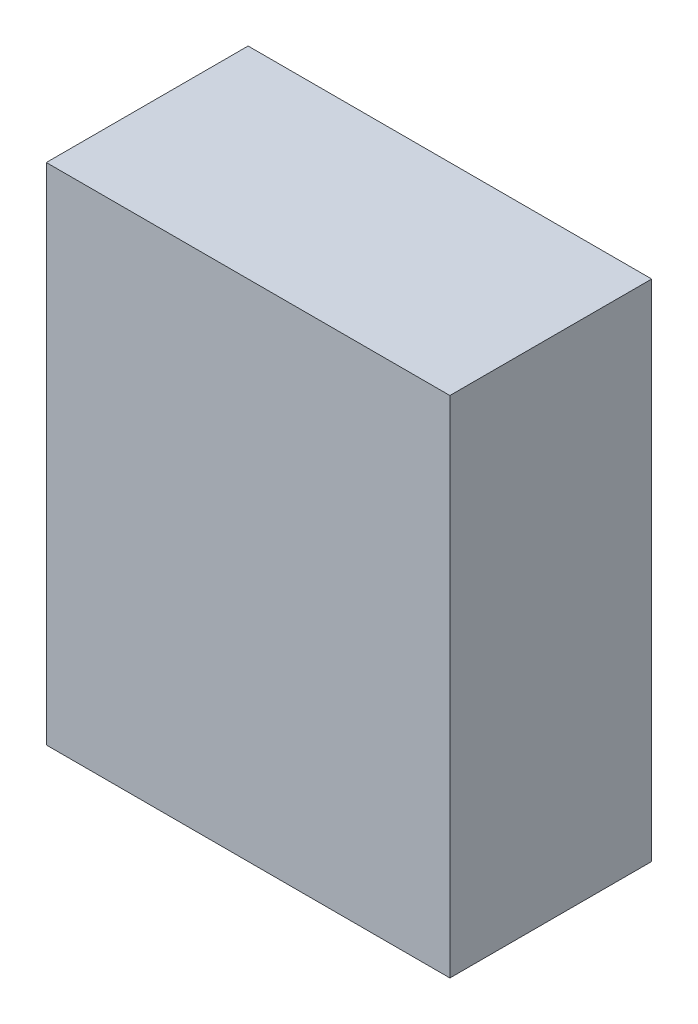
ISO-10303-21;
HEADER;
FILE_DESCRIPTION(('STEP AP214'),'2;1');
FILE_NAME('part.step','',(''),(''),'','','');
FILE_SCHEMA(('AUTOMOTIVE_DESIGN { 1 0 10303 214 1 1 1 1 }'));
ENDSEC;
DATA;
#1=APPLICATION_CONTEXT('core data for automotive mechanical design processes');
#2=APPLICATION_PROTOCOL_DEFINITION('international standard','automotive_design',2000,#1);
#3=PRODUCT_CONTEXT('',#1,'mechanical');
#4=PRODUCT('Part','Part','',(#3));
#5=PRODUCT_RELATED_PRODUCT_CATEGORY('part','',(#4));
#6=PRODUCT_DEFINITION_FORMATION('','',#4);
#7=PRODUCT_DEFINITION_CONTEXT('part definition',#1,'design');
#8=PRODUCT_DEFINITION('design','',#6,#7);
#9=PRODUCT_DEFINITION_SHAPE('','',#8);
#10=(LENGTH_UNIT() NAMED_UNIT(*) SI_UNIT(.MILLI.,.METRE.));
#11=(NAMED_UNIT(*) PLANE_ANGLE_UNIT() SI_UNIT($,.RADIAN.));
#12=(NAMED_UNIT(*) SI_UNIT($,.STERADIAN.) SOLID_ANGLE_UNIT());
#13=UNCERTAINTY_MEASURE_WITH_UNIT(LENGTH_MEASURE(1.E-05),#10,'distance_accuracy_value','');
#14=(GEOMETRIC_REPRESENTATION_CONTEXT(3) GLOBAL_UNCERTAINTY_ASSIGNED_CONTEXT((#13)) GLOBAL_UNIT_ASSIGNED_CONTEXT((#10,
#11,#12)) REPRESENTATION_CONTEXT('',''));
#15=CARTESIAN_POINT('',(0.,0.,0.));
#16=DIRECTION('',(0.,0.,1.));
#17=DIRECTION('',(1.,0.,0.));
#18=AXIS2_PLACEMENT_3D('',#15,#16,#17);
#19=CARTESIAN_POINT('',(50.8,-63.5,50.8));
#20=DIRECTION('',(-1.,0.,0.));
#21=DIRECTION('',(0.,0.,1.));
#22=AXIS2_PLACEMENT_3D('',#19,#20,#21);
#23=PLANE('',#22);
#24=DIRECTION('',(0.,1.,0.));
#25=VECTOR('',#24,1.);
#26=CARTESIAN_POINT('',(50.8,-63.5,0.));
#27=LINE('',#26,#25);
#28=CARTESIAN_POINT('',(50.8,-63.5,0.));
#29=VERTEX_POINT('',#28);
#30=CARTESIAN_POINT('',(50.8,63.5,0.));
#31=VERTEX_POINT('',#30);
#32=EDGE_CURVE('E96',#29,#31,#27,.T.);
#33=ORIENTED_EDGE('',*,*,#32,.T.);
#34=DIRECTION('',(0.,0.,-1.));
#35=VECTOR('',#34,1.);
#36=CARTESIAN_POINT('',(50.8,63.5,50.8));
#37=LINE('',#36,#35);
#38=CARTESIAN_POINT('',(50.8,63.5,50.8));
#39=VERTEX_POINT('',#38);
#40=EDGE_CURVE('E11',#39,#31,#37,.T.);
#41=ORIENTED_EDGE('',*,*,#40,.F.);
#42=DIRECTION('',(0.,1.,0.));
#43=VECTOR('',#42,1.);
#44=CARTESIAN_POINT('',(50.8,-63.5,50.8));
#45=LINE('',#44,#43);
#46=CARTESIAN_POINT('',(50.8,-63.5,50.8));
#47=VERTEX_POINT('',#46);
#48=EDGE_CURVE('E84',#47,#39,#45,.T.);
#49=ORIENTED_EDGE('',*,*,#48,.F.);
#50=DIRECTION('',(0.,0.,-1.));
#51=VECTOR('',#50,1.);
#52=CARTESIAN_POINT('',(50.8,-63.5,50.8));
#53=LINE('',#52,#51);
#54=EDGE_CURVE('E92',#47,#29,#53,.T.);
#55=ORIENTED_EDGE('',*,*,#54,.T.);
#56=EDGE_LOOP('',(#33,#41,#49,#55));
#57=FACE_BOUND('',#56,.T.);
#58=ADVANCED_FACE('F33',(#57),#23,.F.);
#59=CARTESIAN_POINT('',(-50.8,63.5,50.8));
#60=DIRECTION('',(0.,-1.,0.));
#61=DIRECTION('',(0.,0.,-1.));
#62=AXIS2_PLACEMENT_3D('',#59,#60,#61);
#63=PLANE('',#62);
#64=DIRECTION('',(-1.,0.,0.));
#65=VECTOR('',#64,1.);
#66=CARTESIAN_POINT('',(-50.8,63.5,0.));
#67=LINE('',#66,#65);
#68=CARTESIAN_POINT('',(-50.8,63.5,0.));
#69=VERTEX_POINT('',#68);
#70=EDGE_CURVE('E88',#31,#69,#67,.T.);
#71=ORIENTED_EDGE('',*,*,#70,.T.);
#72=DIRECTION('',(0.,0.,-1.));
#73=VECTOR('',#72,1.);
#74=CARTESIAN_POINT('',(-50.8,63.5,50.8));
#75=LINE('',#74,#73);
#76=CARTESIAN_POINT('',(-50.8,63.5,50.8));
#77=VERTEX_POINT('',#76);
#78=EDGE_CURVE('E41',#77,#69,#75,.T.);
#79=ORIENTED_EDGE('',*,*,#78,.F.);
#80=DIRECTION('',(-1.,0.,0.));
#81=VECTOR('',#80,1.);
#82=CARTESIAN_POINT('',(-50.8,63.5,50.8));
#83=LINE('',#82,#81);
#84=EDGE_CURVE('E79',#39,#77,#83,.T.);
#85=ORIENTED_EDGE('',*,*,#84,.F.);
#86=ORIENTED_EDGE('',*,*,#40,.T.);
#87=EDGE_LOOP('',(#71,#79,#85,#86));
#88=FACE_BOUND('',#87,.T.);
#89=ADVANCED_FACE('F87',(#88),#63,.F.);
#90=CARTESIAN_POINT('',(-50.8,-63.5,50.8));
#91=DIRECTION('',(1.,0.,0.));
#92=DIRECTION('',(0.,0.,-1.));
#93=AXIS2_PLACEMENT_3D('',#90,#91,#92);
#94=PLANE('',#93);
#95=DIRECTION('',(0.,-1.,0.));
#96=VECTOR('',#95,1.);
#97=CARTESIAN_POINT('',(-50.8,-63.5,0.));
#98=LINE('',#97,#96);
#99=CARTESIAN_POINT('',(-50.8,-63.5,0.));
#100=VERTEX_POINT('',#99);
#101=EDGE_CURVE('E66',#69,#100,#98,.T.);
#102=ORIENTED_EDGE('',*,*,#101,.T.);
#103=DIRECTION('',(0.,0.,-1.));
#104=VECTOR('',#103,1.);
#105=CARTESIAN_POINT('',(-50.8,-63.5,50.8));
#106=LINE('',#105,#104);
#107=CARTESIAN_POINT('',(-50.8,-63.5,50.8));
#108=VERTEX_POINT('',#107);
#109=EDGE_CURVE('E89',#108,#100,#106,.T.);
#110=ORIENTED_EDGE('',*,*,#109,.F.);
#111=DIRECTION('',(0.,-1.,0.));
#112=VECTOR('',#111,1.);
#113=CARTESIAN_POINT('',(-50.8,-63.5,50.8));
#114=LINE('',#113,#112);
#115=EDGE_CURVE('E82',#77,#108,#114,.T.);
#116=ORIENTED_EDGE('',*,*,#115,.F.);
#117=ORIENTED_EDGE('',*,*,#78,.T.);
#118=EDGE_LOOP('',(#102,#110,#116,#117));
#119=FACE_BOUND('',#118,.T.);
#120=ADVANCED_FACE('F90',(#119),#94,.F.);
#121=CARTESIAN_POINT('',(-50.8,-63.5,50.8));
#122=DIRECTION('',(0.,1.,0.));
#123=DIRECTION('',(0.,0.,1.));
#124=AXIS2_PLACEMENT_3D('',#121,#122,#123);
#125=PLANE('',#124);
#126=DIRECTION('',(1.,0.,0.));
#127=VECTOR('',#126,1.);
#128=CARTESIAN_POINT('',(-50.8,-63.5,0.));
#129=LINE('',#128,#127);
#130=EDGE_CURVE('E72',#100,#29,#129,.T.);
#131=ORIENTED_EDGE('',*,*,#130,.T.);
#132=ORIENTED_EDGE('',*,*,#54,.F.);
#133=DIRECTION('',(1.,0.,0.));
#134=VECTOR('',#133,1.);
#135=CARTESIAN_POINT('',(-50.8,-63.5,50.8));
#136=LINE('',#135,#134);
#137=EDGE_CURVE('E49',#108,#47,#136,.T.);
#138=ORIENTED_EDGE('',*,*,#137,.F.);
#139=ORIENTED_EDGE('',*,*,#109,.T.);
#140=EDGE_LOOP('',(#131,#132,#138,#139));
#141=FACE_BOUND('',#140,.T.);
#142=ADVANCED_FACE('F103',(#141),#125,.F.);
#143=CARTESIAN_POINT('',(0.,0.,50.8));
#144=DIRECTION('',(0.,0.,-1.));
#145=DIRECTION('',(-1.,0.,0.));
#146=AXIS2_PLACEMENT_3D('',#143,#144,#145);
#147=PLANE('',#146);
#148=ORIENTED_EDGE('',*,*,#48,.T.);
#149=ORIENTED_EDGE('',*,*,#84,.T.);
#150=ORIENTED_EDGE('',*,*,#115,.T.);
#151=ORIENTED_EDGE('',*,*,#137,.T.);
#152=EDGE_LOOP('',(#148,#149,#150,#151));
#153=FACE_BOUND('',#152,.T.);
#154=ADVANCED_FACE('F80',(#153),#147,.F.);
#155=CARTESIAN_POINT('',(0.,0.,0.));
#156=DIRECTION('',(0.,0.,-1.));
#157=DIRECTION('',(-1.,0.,0.));
#158=AXIS2_PLACEMENT_3D('',#155,#156,#157);
#159=PLANE('',#158);
#160=ORIENTED_EDGE('',*,*,#32,.F.);
#161=ORIENTED_EDGE('',*,*,#130,.F.);
#162=ORIENTED_EDGE('',*,*,#101,.F.);
#163=ORIENTED_EDGE('',*,*,#70,.F.);
#164=EDGE_LOOP('',(#160,#161,#162,#163));
#165=FACE_BOUND('',#164,.T.);
#166=ADVANCED_FACE('F106',(#165),#159,.T.);
#167=CLOSED_SHELL('',(#58,#89,#120,#142,#154,#166));
#168=MANIFOLD_SOLID_BREP('B2',#167);
#169=ADVANCED_BREP_SHAPE_REPRESENTATION('',(#18,#168),#14);
#170=SHAPE_DEFINITION_REPRESENTATION(#9,#169);
ENDSEC;
END-ISO-10303-21;
